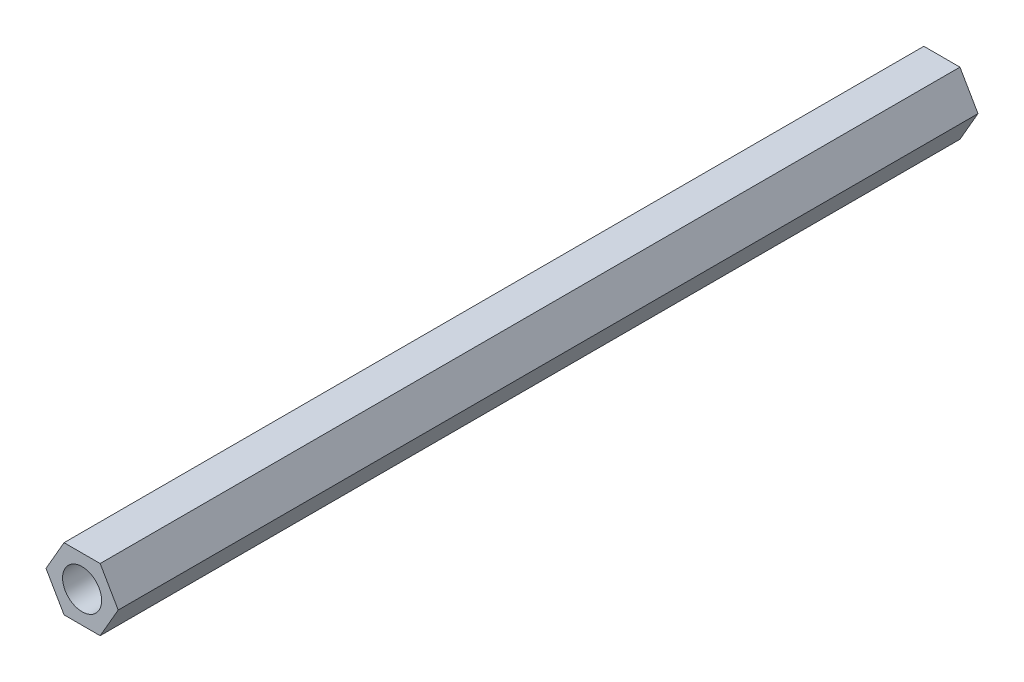
ISO-10303-21;
HEADER;
FILE_DESCRIPTION(('STEP AP214'),'2;1');
FILE_NAME('part.step','',(''),(''),'','','');
FILE_SCHEMA(('AUTOMOTIVE_DESIGN { 1 0 10303 214 1 1 1 1 }'));
ENDSEC;
DATA;
#1=APPLICATION_CONTEXT('core data for automotive mechanical design processes');
#2=APPLICATION_PROTOCOL_DEFINITION('international standard','automotive_design',2000,#1);
#3=PRODUCT_CONTEXT('',#1,'mechanical');
#4=PRODUCT('Part','Part','',(#3));
#5=PRODUCT_RELATED_PRODUCT_CATEGORY('part','',(#4));
#6=PRODUCT_DEFINITION_FORMATION('','',#4);
#7=PRODUCT_DEFINITION_CONTEXT('part definition',#1,'design');
#8=PRODUCT_DEFINITION('design','',#6,#7);
#9=PRODUCT_DEFINITION_SHAPE('','',#8);
#10=(LENGTH_UNIT() NAMED_UNIT(*) SI_UNIT(.MILLI.,.METRE.));
#11=(NAMED_UNIT(*) PLANE_ANGLE_UNIT() SI_UNIT($,.RADIAN.));
#12=(NAMED_UNIT(*) SI_UNIT($,.STERADIAN.) SOLID_ANGLE_UNIT());
#13=UNCERTAINTY_MEASURE_WITH_UNIT(LENGTH_MEASURE(1.E-05),#10,'distance_accuracy_value','');
#14=(GEOMETRIC_REPRESENTATION_CONTEXT(3) GLOBAL_UNCERTAINTY_ASSIGNED_CONTEXT((#13)) GLOBAL_UNIT_ASSIGNED_CONTEXT((#10,
#11,#12)) REPRESENTATION_CONTEXT('',''));
#15=CARTESIAN_POINT('',(0.,0.,0.));
#16=DIRECTION('',(0.,0.,1.));
#17=DIRECTION('',(1.,0.,0.));
#18=AXIS2_PLACEMENT_3D('',#15,#16,#17);
#19=CARTESIAN_POINT('',(1.15470053837927,-1.99999999999999,-55.));
#20=DIRECTION('',(0.866025403784441,-0.499999999999995,0.));
#21=DIRECTION('',(0.499999999999995,0.866025403784441,0.));
#22=AXIS2_PLACEMENT_3D('',#19,#20,#21);
#23=PLANE('',#22);
#24=DIRECTION('',(0.499999999999995,0.866025403784441,0.));
#25=VECTOR('',#24,1.);
#26=CARTESIAN_POINT('',(1.15470053837927,-1.99999999999999,0.));
#27=LINE('',#26,#25);
#28=CARTESIAN_POINT('',(1.15470053837927,-1.99999999999999,0.));
#29=VERTEX_POINT('',#28);
#30=CARTESIAN_POINT('',(2.3094010767585,0.,0.));
#31=VERTEX_POINT('',#30);
#32=EDGE_CURVE('E130',#29,#31,#27,.T.);
#33=ORIENTED_EDGE('',*,*,#32,.F.);
#34=DIRECTION('',(0.,0.,1.));
#35=VECTOR('',#34,1.);
#36=CARTESIAN_POINT('',(1.15470053837927,-1.99999999999999,-55.));
#37=LINE('',#36,#35);
#38=CARTESIAN_POINT('',(1.15470053837927,-1.99999999999999,-55.));
#39=VERTEX_POINT('',#38);
#40=EDGE_CURVE('E11',#39,#29,#37,.T.);
#41=ORIENTED_EDGE('',*,*,#40,.F.);
#42=DIRECTION('',(0.499999999999995,0.866025403784441,0.));
#43=VECTOR('',#42,1.);
#44=CARTESIAN_POINT('',(1.15470053837927,-1.99999999999999,-55.));
#45=LINE('',#44,#43);
#46=CARTESIAN_POINT('',(2.3094010767585,0.,-55.));
#47=VERTEX_POINT('',#46);
#48=EDGE_CURVE('E142',#39,#47,#45,.T.);
#49=ORIENTED_EDGE('',*,*,#48,.T.);
#50=DIRECTION('',(0.,0.,1.));
#51=VECTOR('',#50,1.);
#52=CARTESIAN_POINT('',(2.3094010767585,0.,-55.));
#53=LINE('',#52,#51);
#54=EDGE_CURVE('E93',#47,#31,#53,.T.);
#55=ORIENTED_EDGE('',*,*,#54,.T.);
#56=EDGE_LOOP('',(#33,#41,#49,#55));
#57=FACE_BOUND('',#56,.T.);
#58=ADVANCED_FACE('F39',(#57),#23,.T.);
#59=CARTESIAN_POINT('',(-1.15470053837923,-2.00000000000001,-55.));
#60=DIRECTION('',(0.,-1.,0.));
#61=DIRECTION('',(1.,0.,0.));
#62=AXIS2_PLACEMENT_3D('',#59,#60,#61);
#63=PLANE('',#62);
#64=DIRECTION('',(1.,0.,0.));
#65=VECTOR('',#64,1.);
#66=CARTESIAN_POINT('',(-1.15470053837923,-2.00000000000001,0.));
#67=LINE('',#66,#65);
#68=CARTESIAN_POINT('',(-1.15470053837923,-2.00000000000001,0.));
#69=VERTEX_POINT('',#68);
#70=EDGE_CURVE('E139',#69,#29,#67,.T.);
#71=ORIENTED_EDGE('',*,*,#70,.F.);
#72=DIRECTION('',(0.,0.,1.));
#73=VECTOR('',#72,1.);
#74=CARTESIAN_POINT('',(-1.15470053837923,-2.00000000000001,-55.));
#75=LINE('',#74,#73);
#76=CARTESIAN_POINT('',(-1.15470053837923,-2.00000000000001,-55.));
#77=VERTEX_POINT('',#76);
#78=EDGE_CURVE('E49',#77,#69,#75,.T.);
#79=ORIENTED_EDGE('',*,*,#78,.F.);
#80=DIRECTION('',(1.,0.,0.));
#81=VECTOR('',#80,1.);
#82=CARTESIAN_POINT('',(-1.15470053837923,-2.00000000000001,-55.));
#83=LINE('',#82,#81);
#84=EDGE_CURVE('E119',#77,#39,#83,.T.);
#85=ORIENTED_EDGE('',*,*,#84,.T.);
#86=ORIENTED_EDGE('',*,*,#40,.T.);
#87=EDGE_LOOP('',(#71,#79,#85,#86));
#88=FACE_BOUND('',#87,.T.);
#89=ADVANCED_FACE('F177',(#88),#63,.T.);
#90=CARTESIAN_POINT('',(-2.3094010767585,0.,-55.));
#91=DIRECTION('',(-0.866025403784435,-0.500000000000007,0.));
#92=DIRECTION('',(0.500000000000007,-0.866025403784435,0.));
#93=AXIS2_PLACEMENT_3D('',#90,#91,#92);
#94=PLANE('',#93);
#95=DIRECTION('',(0.500000000000007,-0.866025403784435,0.));
#96=VECTOR('',#95,1.);
#97=CARTESIAN_POINT('',(-2.3094010767585,0.,0.));
#98=LINE('',#97,#96);
#99=CARTESIAN_POINT('',(-2.3094010767585,0.,0.));
#100=VERTEX_POINT('',#99);
#101=EDGE_CURVE('E102',#100,#69,#98,.T.);
#102=ORIENTED_EDGE('',*,*,#101,.F.);
#103=DIRECTION('',(0.,0.,1.));
#104=VECTOR('',#103,1.);
#105=CARTESIAN_POINT('',(-2.3094010767585,0.,-55.));
#106=LINE('',#105,#104);
#107=CARTESIAN_POINT('',(-2.3094010767585,0.,-55.));
#108=VERTEX_POINT('',#107);
#109=EDGE_CURVE('E97',#108,#100,#106,.T.);
#110=ORIENTED_EDGE('',*,*,#109,.F.);
#111=DIRECTION('',(0.500000000000007,-0.866025403784435,0.));
#112=VECTOR('',#111,1.);
#113=CARTESIAN_POINT('',(-2.3094010767585,0.,-55.));
#114=LINE('',#113,#112);
#115=EDGE_CURVE('E105',#108,#77,#114,.T.);
#116=ORIENTED_EDGE('',*,*,#115,.T.);
#117=ORIENTED_EDGE('',*,*,#78,.T.);
#118=EDGE_LOOP('',(#102,#110,#116,#117));
#119=FACE_BOUND('',#118,.T.);
#120=ADVANCED_FACE('F101',(#119),#94,.T.);
#121=CARTESIAN_POINT('',(-1.15470053837926,1.99999999999999,-55.));
#122=DIRECTION('',(-0.866025403784441,0.499999999999995,0.));
#123=DIRECTION('',(-0.499999999999995,-0.866025403784442,0.));
#124=AXIS2_PLACEMENT_3D('',#121,#122,#123);
#125=PLANE('',#124);
#126=DIRECTION('',(-0.499999999999995,-0.866025403784441,0.));
#127=VECTOR('',#126,1.);
#128=CARTESIAN_POINT('',(-1.15470053837926,1.99999999999999,0.));
#129=LINE('',#128,#127);
#130=CARTESIAN_POINT('',(-1.15470053837926,1.99999999999999,0.));
#131=VERTEX_POINT('',#130);
#132=EDGE_CURVE('E140',#131,#100,#129,.T.);
#133=ORIENTED_EDGE('',*,*,#132,.F.);
#134=DIRECTION('',(0.,0.,1.));
#135=VECTOR('',#134,1.);
#136=CARTESIAN_POINT('',(-1.15470053837926,1.99999999999999,-55.));
#137=LINE('',#136,#135);
#138=CARTESIAN_POINT('',(-1.15470053837926,1.99999999999999,-55.));
#139=VERTEX_POINT('',#138);
#140=EDGE_CURVE('E108',#139,#131,#137,.T.);
#141=ORIENTED_EDGE('',*,*,#140,.F.);
#142=DIRECTION('',(-0.499999999999995,-0.866025403784441,0.));
#143=VECTOR('',#142,1.);
#144=CARTESIAN_POINT('',(-1.15470053837926,1.99999999999999,-55.));
#145=LINE('',#144,#143);
#146=EDGE_CURVE('E113',#139,#108,#145,.T.);
#147=ORIENTED_EDGE('',*,*,#146,.T.);
#148=ORIENTED_EDGE('',*,*,#109,.T.);
#149=EDGE_LOOP('',(#133,#141,#147,#148));
#150=FACE_BOUND('',#149,.T.);
#151=ADVANCED_FACE('F120',(#150),#125,.T.);
#152=CARTESIAN_POINT('',(1.15470053837925,2.,-55.));
#153=DIRECTION('',(0.,1.,0.));
#154=DIRECTION('',(-1.,0.,0.));
#155=AXIS2_PLACEMENT_3D('',#152,#153,#154);
#156=PLANE('',#155);
#157=DIRECTION('',(-1.,0.,0.));
#158=VECTOR('',#157,1.);
#159=CARTESIAN_POINT('',(1.15470053837925,2.,0.));
#160=LINE('',#159,#158);
#161=CARTESIAN_POINT('',(1.15470053837925,2.,0.));
#162=VERTEX_POINT('',#161);
#163=EDGE_CURVE('E135',#162,#131,#160,.T.);
#164=ORIENTED_EDGE('',*,*,#163,.F.);
#165=DIRECTION('',(0.,0.,1.));
#166=VECTOR('',#165,1.);
#167=CARTESIAN_POINT('',(1.15470053837925,2.,-55.));
#168=LINE('',#167,#166);
#169=CARTESIAN_POINT('',(1.15470053837925,2.,-55.));
#170=VERTEX_POINT('',#169);
#171=EDGE_CURVE('E148',#170,#162,#168,.T.);
#172=ORIENTED_EDGE('',*,*,#171,.F.);
#173=DIRECTION('',(-1.,0.,0.));
#174=VECTOR('',#173,1.);
#175=CARTESIAN_POINT('',(1.15470053837925,2.,-55.));
#176=LINE('',#175,#174);
#177=EDGE_CURVE('E116',#170,#139,#176,.T.);
#178=ORIENTED_EDGE('',*,*,#177,.T.);
#179=ORIENTED_EDGE('',*,*,#140,.T.);
#180=EDGE_LOOP('',(#164,#172,#178,#179));
#181=FACE_BOUND('',#180,.T.);
#182=ADVANCED_FACE('F188',(#181),#156,.T.);
#183=CARTESIAN_POINT('',(2.3094010767585,0.,-55.));
#184=DIRECTION('',(0.866025403784438,0.500000000000001,0.));
#185=DIRECTION('',(-0.500000000000001,0.866025403784438,0.));
#186=AXIS2_PLACEMENT_3D('',#183,#184,#185);
#187=PLANE('',#186);
#188=DIRECTION('',(-0.500000000000001,0.866025403784438,0.));
#189=VECTOR('',#188,1.);
#190=CARTESIAN_POINT('',(2.3094010767585,0.,0.));
#191=LINE('',#190,#189);
#192=EDGE_CURVE('E128',#31,#162,#191,.T.);
#193=ORIENTED_EDGE('',*,*,#192,.F.);
#194=ORIENTED_EDGE('',*,*,#54,.F.);
#195=DIRECTION('',(-0.500000000000001,0.866025403784438,0.));
#196=VECTOR('',#195,1.);
#197=CARTESIAN_POINT('',(2.3094010767585,0.,-55.));
#198=LINE('',#197,#196);
#199=EDGE_CURVE('E125',#47,#170,#198,.T.);
#200=ORIENTED_EDGE('',*,*,#199,.T.);
#201=ORIENTED_EDGE('',*,*,#171,.T.);
#202=EDGE_LOOP('',(#193,#194,#200,#201));
#203=FACE_BOUND('',#202,.T.);
#204=ADVANCED_FACE('F171',(#203),#187,.T.);
#205=CARTESIAN_POINT('',(0.,0.,-55.));
#206=DIRECTION('',(0.,0.,1.));
#207=DIRECTION('',(1.,0.,0.));
#208=AXIS2_PLACEMENT_3D('',#205,#206,#207);
#209=PLANE('',#208);
#210=CARTESIAN_POINT('',(0.,0.,-55.));
#211=DIRECTION('',(0.,0.,1.));
#212=DIRECTION('',(1.,0.,0.));
#213=AXIS2_PLACEMENT_3D('',#210,#211,#212);
#214=CIRCLE('',#213,1.25);
#215=CARTESIAN_POINT('',(1.25,0.,-55.));
#216=VERTEX_POINT('',#215);
#217=EDGE_CURVE('E154',#216,#216,#214,.T.);
#218=ORIENTED_EDGE('',*,*,#217,.T.);
#219=EDGE_LOOP('',(#218));
#220=FACE_BOUND('',#219,.T.);
#221=ORIENTED_EDGE('',*,*,#48,.F.);
#222=ORIENTED_EDGE('',*,*,#84,.F.);
#223=ORIENTED_EDGE('',*,*,#115,.F.);
#224=ORIENTED_EDGE('',*,*,#146,.F.);
#225=ORIENTED_EDGE('',*,*,#177,.F.);
#226=ORIENTED_EDGE('',*,*,#199,.F.);
#227=EDGE_LOOP('',(#221,#222,#223,#224,#225,#226));
#228=FACE_BOUND('',#227,.T.);
#229=ADVANCED_FACE('F114',(#220,#228),#209,.F.);
#230=CARTESIAN_POINT('',(0.,0.,0.));
#231=DIRECTION('',(0.,0.,1.));
#232=DIRECTION('',(1.,0.,0.));
#233=AXIS2_PLACEMENT_3D('',#230,#231,#232);
#234=PLANE('',#233);
#235=CARTESIAN_POINT('',(0.,0.,1.2E-05));
#236=DIRECTION('',(0.,0.,1.));
#237=DIRECTION('',(1.,0.,0.));
#238=AXIS2_PLACEMENT_3D('',#235,#236,#237);
#239=CIRCLE('',#238,1.25);
#240=CARTESIAN_POINT('',(1.25,0.,1.2E-05));
#241=VERTEX_POINT('',#240);
#242=EDGE_CURVE('E133',#241,#241,#239,.T.);
#243=ORIENTED_EDGE('',*,*,#242,.F.);
#244=EDGE_LOOP('',(#243));
#245=FACE_BOUND('',#244,.T.);
#246=ORIENTED_EDGE('',*,*,#32,.T.);
#247=ORIENTED_EDGE('',*,*,#192,.T.);
#248=ORIENTED_EDGE('',*,*,#163,.T.);
#249=ORIENTED_EDGE('',*,*,#132,.T.);
#250=ORIENTED_EDGE('',*,*,#101,.T.);
#251=ORIENTED_EDGE('',*,*,#70,.T.);
#252=EDGE_LOOP('',(#246,#247,#248,#249,#250,#251));
#253=FACE_BOUND('',#252,.T.);
#254=ADVANCED_FACE('F151',(#245,#253),#234,.T.);
#255=CARTESIAN_POINT('',(0.,0.,1.2E-05));
#256=DIRECTION('',(0.,0.,-1.));
#257=DIRECTION('',(-1.,0.,0.));
#258=AXIS2_PLACEMENT_3D('',#255,#256,#257);
#259=CYLINDRICAL_SURFACE('',#258,1.25);
#260=ORIENTED_EDGE('',*,*,#242,.T.);
#261=EDGE_LOOP('',(#260));
#262=FACE_BOUND('',#261,.T.);
#263=ORIENTED_EDGE('',*,*,#217,.F.);
#264=EDGE_LOOP('',(#263));
#265=FACE_BOUND('',#264,.T.);
#266=ADVANCED_FACE('F164',(#262,#265),#259,.F.);
#267=CLOSED_SHELL('',(#58,#89,#120,#151,#182,#204,#229,#254,#266));
#268=MANIFOLD_SOLID_BREP('B2',#267);
#269=ADVANCED_BREP_SHAPE_REPRESENTATION('',(#18,#268),#14);
#270=SHAPE_DEFINITION_REPRESENTATION(#9,#269);
ENDSEC;
END-ISO-10303-21;
